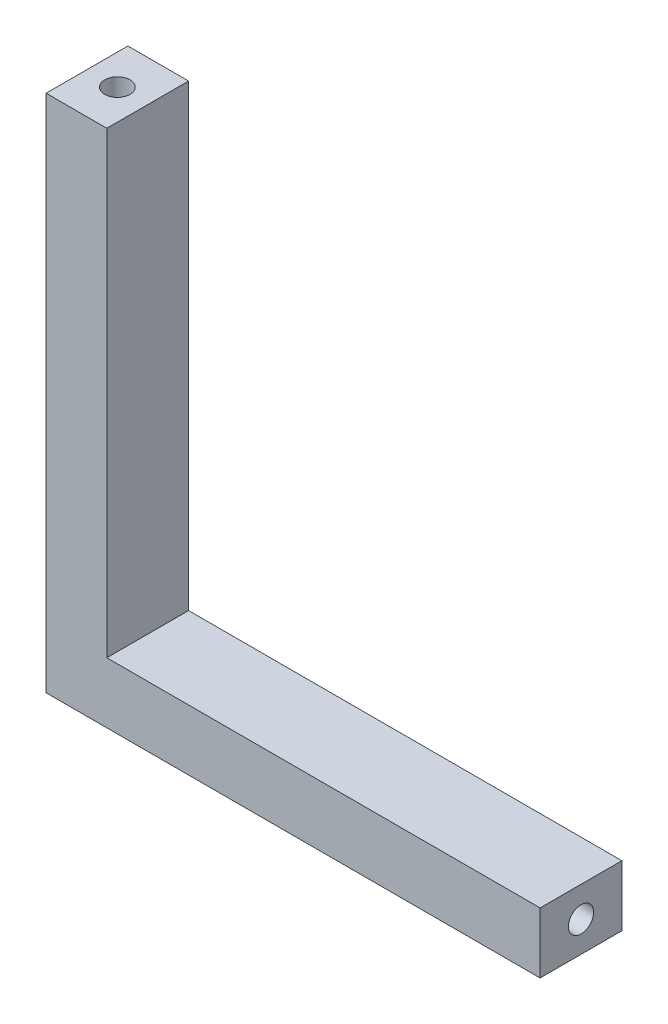
ISO-10303-21;
HEADER;
FILE_DESCRIPTION(('STEP AP214'),'2;1');
FILE_NAME('part.step','',(''),(''),'','','');
FILE_SCHEMA(('AUTOMOTIVE_DESIGN { 1 0 10303 214 1 1 1 1 }'));
ENDSEC;
DATA;
#1=APPLICATION_CONTEXT('core data for automotive mechanical design processes');
#2=APPLICATION_PROTOCOL_DEFINITION('international standard','automotive_design',2000,#1);
#3=PRODUCT_CONTEXT('',#1,'mechanical');
#4=PRODUCT('Part','Part','',(#3));
#5=PRODUCT_RELATED_PRODUCT_CATEGORY('part','',(#4));
#6=PRODUCT_DEFINITION_FORMATION('','',#4);
#7=PRODUCT_DEFINITION_CONTEXT('part definition',#1,'design');
#8=PRODUCT_DEFINITION('design','',#6,#7);
#9=PRODUCT_DEFINITION_SHAPE('','',#8);
#10=(LENGTH_UNIT() NAMED_UNIT(*) SI_UNIT(.MILLI.,.METRE.));
#11=(NAMED_UNIT(*) PLANE_ANGLE_UNIT() SI_UNIT($,.RADIAN.));
#12=(NAMED_UNIT(*) SI_UNIT($,.STERADIAN.) SOLID_ANGLE_UNIT());
#13=UNCERTAINTY_MEASURE_WITH_UNIT(LENGTH_MEASURE(1.E-05),#10,'distance_accuracy_value','');
#14=(GEOMETRIC_REPRESENTATION_CONTEXT(3) GLOBAL_UNCERTAINTY_ASSIGNED_CONTEXT((#13)) GLOBAL_UNIT_ASSIGNED_CONTEXT((#10,
#11,#12)) REPRESENTATION_CONTEXT('',''));
#15=CARTESIAN_POINT('',(0.,0.,0.));
#16=DIRECTION('',(0.,0.,1.));
#17=DIRECTION('',(1.,0.,0.));
#18=AXIS2_PLACEMENT_3D('',#15,#16,#17);
#19=CARTESIAN_POINT('',(0.,0.,0.));
#20=DIRECTION('',(0.,1.,0.));
#21=DIRECTION('',(0.,0.,1.));
#22=AXIS2_PLACEMENT_3D('',#19,#20,#21);
#23=CYLINDRICAL_SURFACE('',#22,1.5);
#24=CARTESIAN_POINT('',(0.,58.,0.));
#25=DIRECTION('',(0.,1.,0.));
#26=DIRECTION('',(0.,0.,1.));
#27=AXIS2_PLACEMENT_3D('',#24,#25,#26);
#28=CIRCLE('',#27,1.5);
#29=CARTESIAN_POINT('',(0.,58.,1.5));
#30=VERTEX_POINT('',#29);
#31=EDGE_CURVE('E90',#30,#30,#28,.F.);
#32=ORIENTED_EDGE('',*,*,#31,.F.);
#33=EDGE_LOOP('',(#32));
#34=FACE_BOUND('',#33,.T.);
#35=CARTESIAN_POINT('',(0.,0.,0.));
#36=DIRECTION('',(-0.707106781186547,0.707106781186547,0.));
#37=DIRECTION('',(0.707106781186547,0.707106781186547,0.));
#38=AXIS2_PLACEMENT_3D('',#35,#36,#37);
#39=ELLIPSE('',#38,2.12132034355964,1.5);
#40=CARTESIAN_POINT('',(1.5,1.5,0.));
#41=VERTEX_POINT('',#40);
#42=EDGE_CURVE('E19',#41,#41,#39,.F.);
#43=ORIENTED_EDGE('',*,*,#42,.T.);
#44=EDGE_LOOP('',(#43));
#45=FACE_BOUND('',#44,.T.);
#46=ADVANCED_FACE('F16',(#34,#45),#23,.F.);
#47=CARTESIAN_POINT('',(-12.0801490057035,-3.6,4.85));
#48=DIRECTION('',(0.,0.,1.));
#49=DIRECTION('',(0.,-1.,0.));
#50=AXIS2_PLACEMENT_3D('',#47,#48,#49);
#51=PLANE('',#50);
#52=DIRECTION('',(1.,0.,0.));
#53=VECTOR('',#52,1.);
#54=CARTESIAN_POINT('',(-12.0801490057035,-3.6,4.85));
#55=LINE('',#54,#53);
#56=CARTESIAN_POINT('',(55.,-3.6,4.85));
#57=VERTEX_POINT('',#56);
#58=CARTESIAN_POINT('',(-3.6,-3.6,4.85));
#59=VERTEX_POINT('',#58);
#60=EDGE_CURVE('E72',#57,#59,#55,.F.);
#61=ORIENTED_EDGE('',*,*,#60,.F.);
#62=DIRECTION('',(0.,1.,0.));
#63=VECTOR('',#62,1.);
#64=CARTESIAN_POINT('',(55.,3.6,4.85));
#65=LINE('',#64,#63);
#66=CARTESIAN_POINT('',(55.,3.6,4.85));
#67=VERTEX_POINT('',#66);
#68=EDGE_CURVE('E99',#57,#67,#65,.T.);
#69=ORIENTED_EDGE('',*,*,#68,.T.);
#70=DIRECTION('',(-1.,0.,0.));
#71=VECTOR('',#70,1.);
#72=CARTESIAN_POINT('',(-12.0801490057035,3.6,4.85));
#73=LINE('',#72,#71);
#74=CARTESIAN_POINT('',(3.6,3.6,4.85));
#75=VERTEX_POINT('',#74);
#76=EDGE_CURVE('E109',#75,#67,#73,.F.);
#77=ORIENTED_EDGE('',*,*,#76,.F.);
#78=DIRECTION('',(0.,1.,0.));
#79=VECTOR('',#78,1.);
#80=CARTESIAN_POINT('',(3.6,3.6,4.85));
#81=LINE('',#80,#79);
#82=CARTESIAN_POINT('',(3.6,58.,4.84999999999999));
#83=VERTEX_POINT('',#82);
#84=EDGE_CURVE('E116',#75,#83,#81,.T.);
#85=ORIENTED_EDGE('',*,*,#84,.T.);
#86=DIRECTION('',(1.,0.,0.));
#87=VECTOR('',#86,1.);
#88=CARTESIAN_POINT('',(0.,58.,4.85));
#89=LINE('',#88,#87);
#90=CARTESIAN_POINT('',(-3.6,58.,4.85));
#91=VERTEX_POINT('',#90);
#92=EDGE_CURVE('E66',#91,#83,#89,.T.);
#93=ORIENTED_EDGE('',*,*,#92,.F.);
#94=DIRECTION('',(0.,1.,0.));
#95=VECTOR('',#94,1.);
#96=CARTESIAN_POINT('',(-3.6,-3.6,4.85));
#97=LINE('',#96,#95);
#98=EDGE_CURVE('E68',#91,#59,#97,.F.);
#99=ORIENTED_EDGE('',*,*,#98,.T.);
#100=EDGE_LOOP('',(#61,#69,#77,#85,#93,#99));
#101=FACE_BOUND('',#100,.T.);
#102=ADVANCED_FACE('F70',(#101),#51,.T.);
#103=CARTESIAN_POINT('',(-12.0801490057035,0.,0.));
#104=DIRECTION('',(1.,0.,0.));
#105=DIRECTION('',(0.,1.,0.));
#106=AXIS2_PLACEMENT_3D('',#103,#104,#105);
#107=CYLINDRICAL_SURFACE('',#106,1.5);
#108=ORIENTED_EDGE('',*,*,#42,.F.);
#109=EDGE_LOOP('',(#108));
#110=FACE_BOUND('',#109,.T.);
#111=CARTESIAN_POINT('',(55.,0.,0.));
#112=DIRECTION('',(1.,0.,0.));
#113=DIRECTION('',(0.,1.,0.));
#114=AXIS2_PLACEMENT_3D('',#111,#112,#113);
#115=CIRCLE('',#114,1.5);
#116=CARTESIAN_POINT('',(55.,1.5,0.));
#117=VERTEX_POINT('',#116);
#118=EDGE_CURVE('E96',#117,#117,#115,.T.);
#119=ORIENTED_EDGE('',*,*,#118,.T.);
#120=EDGE_LOOP('',(#119));
#121=FACE_BOUND('',#120,.T.);
#122=ADVANCED_FACE('F196',(#110,#121),#107,.F.);
#123=CARTESIAN_POINT('',(-12.0801490057035,-3.6,4.85));
#124=DIRECTION('',(0.,-1.,0.));
#125=DIRECTION('',(1.,0.,0.));
#126=AXIS2_PLACEMENT_3D('',#123,#124,#125);
#127=PLANE('',#126);
#128=DIRECTION('',(1.,0.,0.));
#129=VECTOR('',#128,1.);
#130=CARTESIAN_POINT('',(-12.0801490057035,-3.6,-4.85));
#131=LINE('',#130,#129);
#132=CARTESIAN_POINT('',(55.,-3.6,-4.85));
#133=VERTEX_POINT('',#132);
#134=CARTESIAN_POINT('',(-3.6,-3.6,-4.85));
#135=VERTEX_POINT('',#134);
#136=EDGE_CURVE('E98',#133,#135,#131,.F.);
#137=ORIENTED_EDGE('',*,*,#136,.F.);
#138=DIRECTION('',(0.,0.,1.));
#139=VECTOR('',#138,1.);
#140=CARTESIAN_POINT('',(55.,-3.6,4.85));
#141=LINE('',#140,#139);
#142=EDGE_CURVE('E83',#133,#57,#141,.T.);
#143=ORIENTED_EDGE('',*,*,#142,.T.);
#144=ORIENTED_EDGE('',*,*,#60,.T.);
#145=DIRECTION('',(0.,0.,-1.));
#146=VECTOR('',#145,1.);
#147=CARTESIAN_POINT('',(-3.6,-3.6,4.85));
#148=LINE('',#147,#146);
#149=EDGE_CURVE('E77',#59,#135,#148,.T.);
#150=ORIENTED_EDGE('',*,*,#149,.T.);
#151=EDGE_LOOP('',(#137,#143,#144,#150));
#152=FACE_BOUND('',#151,.T.);
#153=ADVANCED_FACE('F80',(#152),#127,.T.);
#154=CARTESIAN_POINT('',(-3.6,-3.6,4.85));
#155=DIRECTION('',(1.,0.,0.));
#156=DIRECTION('',(0.,0.,-1.));
#157=AXIS2_PLACEMENT_3D('',#154,#155,#156);
#158=PLANE('',#157);
#159=DIRECTION('',(0.,1.,0.));
#160=VECTOR('',#159,1.);
#161=CARTESIAN_POINT('',(-3.6,-3.6,-4.85));
#162=LINE('',#161,#160);
#163=CARTESIAN_POINT('',(-3.6,58.,-4.85));
#164=VERTEX_POINT('',#163);
#165=EDGE_CURVE('E88',#135,#164,#162,.T.);
#166=ORIENTED_EDGE('',*,*,#165,.F.);
#167=ORIENTED_EDGE('',*,*,#149,.F.);
#168=ORIENTED_EDGE('',*,*,#98,.F.);
#169=DIRECTION('',(0.,0.,1.));
#170=VECTOR('',#169,1.);
#171=CARTESIAN_POINT('',(-3.6,58.,0.));
#172=LINE('',#171,#170);
#173=EDGE_CURVE('E117',#164,#91,#172,.T.);
#174=ORIENTED_EDGE('',*,*,#173,.F.);
#175=EDGE_LOOP('',(#166,#167,#168,#174));
#176=FACE_BOUND('',#175,.T.);
#177=ADVANCED_FACE('F86',(#176),#158,.F.);
#178=CARTESIAN_POINT('',(0.,58.,0.));
#179=DIRECTION('',(0.,1.,0.));
#180=DIRECTION('',(0.,0.,1.));
#181=AXIS2_PLACEMENT_3D('',#178,#179,#180);
#182=PLANE('',#181);
#183=DIRECTION('',(1.,0.,0.));
#184=VECTOR('',#183,1.);
#185=CARTESIAN_POINT('',(-12.0801490057035,58.,-4.84999999999999));
#186=LINE('',#185,#184);
#187=CARTESIAN_POINT('',(3.6,58.,-4.85));
#188=VERTEX_POINT('',#187);
#189=EDGE_CURVE('E131',#164,#188,#186,.T.);
#190=ORIENTED_EDGE('',*,*,#189,.F.);
#191=ORIENTED_EDGE('',*,*,#173,.T.);
#192=ORIENTED_EDGE('',*,*,#92,.T.);
#193=DIRECTION('',(0.,0.,1.));
#194=VECTOR('',#193,1.);
#195=CARTESIAN_POINT('',(3.6,58.,4.85));
#196=LINE('',#195,#194);
#197=EDGE_CURVE('E114',#83,#188,#196,.F.);
#198=ORIENTED_EDGE('',*,*,#197,.T.);
#199=EDGE_LOOP('',(#190,#191,#192,#198));
#200=FACE_BOUND('',#199,.T.);
#201=ORIENTED_EDGE('',*,*,#31,.T.);
#202=EDGE_LOOP('',(#201));
#203=FACE_BOUND('',#202,.T.);
#204=ADVANCED_FACE('F121',(#200,#203),#182,.T.);
#205=CARTESIAN_POINT('',(3.6,3.6,4.85));
#206=DIRECTION('',(-1.,0.,0.));
#207=DIRECTION('',(0.,0.,1.));
#208=AXIS2_PLACEMENT_3D('',#205,#206,#207);
#209=PLANE('',#208);
#210=ORIENTED_EDGE('',*,*,#84,.F.);
#211=DIRECTION('',(0.,0.,1.));
#212=VECTOR('',#211,1.);
#213=CARTESIAN_POINT('',(3.6,3.6,4.85));
#214=LINE('',#213,#212);
#215=CARTESIAN_POINT('',(3.6,3.6,-4.85));
#216=VERTEX_POINT('',#215);
#217=EDGE_CURVE('E111',#216,#75,#214,.T.);
#218=ORIENTED_EDGE('',*,*,#217,.F.);
#219=DIRECTION('',(0.,1.,0.));
#220=VECTOR('',#219,1.);
#221=CARTESIAN_POINT('',(3.6,-3.6,-4.85));
#222=LINE('',#221,#220);
#223=EDGE_CURVE('E127',#188,#216,#222,.F.);
#224=ORIENTED_EDGE('',*,*,#223,.F.);
#225=ORIENTED_EDGE('',*,*,#197,.F.);
#226=EDGE_LOOP('',(#210,#218,#224,#225));
#227=FACE_BOUND('',#226,.T.);
#228=ADVANCED_FACE('F125',(#227),#209,.F.);
#229=CARTESIAN_POINT('',(-12.0801490057035,3.6,4.85));
#230=DIRECTION('',(0.,1.,0.));
#231=DIRECTION('',(-1.,0.,0.));
#232=AXIS2_PLACEMENT_3D('',#229,#230,#231);
#233=PLANE('',#232);
#234=ORIENTED_EDGE('',*,*,#76,.T.);
#235=DIRECTION('',(0.,0.,1.));
#236=VECTOR('',#235,1.);
#237=CARTESIAN_POINT('',(55.,3.6,4.85));
#238=LINE('',#237,#236);
#239=CARTESIAN_POINT('',(55.,3.6,-4.85));
#240=VERTEX_POINT('',#239);
#241=EDGE_CURVE('E34',#67,#240,#238,.F.);
#242=ORIENTED_EDGE('',*,*,#241,.T.);
#243=DIRECTION('',(1.,0.,0.));
#244=VECTOR('',#243,1.);
#245=CARTESIAN_POINT('',(-12.0801490057035,3.6,-4.85));
#246=LINE('',#245,#244);
#247=EDGE_CURVE('E25',#216,#240,#246,.T.);
#248=ORIENTED_EDGE('',*,*,#247,.F.);
#249=ORIENTED_EDGE('',*,*,#217,.T.);
#250=EDGE_LOOP('',(#234,#242,#248,#249));
#251=FACE_BOUND('',#250,.T.);
#252=ADVANCED_FACE('F136',(#251),#233,.T.);
#253=CARTESIAN_POINT('',(55.,3.6,4.85));
#254=DIRECTION('',(-1.,0.,0.));
#255=DIRECTION('',(0.,0.,1.));
#256=AXIS2_PLACEMENT_3D('',#253,#254,#255);
#257=PLANE('',#256);
#258=ORIENTED_EDGE('',*,*,#118,.F.);
#259=EDGE_LOOP('',(#258));
#260=FACE_BOUND('',#259,.T.);
#261=ORIENTED_EDGE('',*,*,#142,.F.);
#262=DIRECTION('',(0.,1.,0.));
#263=VECTOR('',#262,1.);
#264=CARTESIAN_POINT('',(55.,-3.6,-4.85));
#265=LINE('',#264,#263);
#266=EDGE_CURVE('E11',#240,#133,#265,.F.);
#267=ORIENTED_EDGE('',*,*,#266,.F.);
#268=ORIENTED_EDGE('',*,*,#241,.F.);
#269=ORIENTED_EDGE('',*,*,#68,.F.);
#270=EDGE_LOOP('',(#261,#267,#268,#269));
#271=FACE_BOUND('',#270,.T.);
#272=ADVANCED_FACE('F138',(#260,#271),#257,.F.);
#273=CARTESIAN_POINT('',(-12.0801490057035,-3.6,-4.85));
#274=DIRECTION('',(0.,0.,-1.));
#275=DIRECTION('',(0.,1.,0.));
#276=AXIS2_PLACEMENT_3D('',#273,#274,#275);
#277=PLANE('',#276);
#278=ORIENTED_EDGE('',*,*,#247,.T.);
#279=ORIENTED_EDGE('',*,*,#266,.T.);
#280=ORIENTED_EDGE('',*,*,#136,.T.);
#281=ORIENTED_EDGE('',*,*,#165,.T.);
#282=ORIENTED_EDGE('',*,*,#189,.T.);
#283=ORIENTED_EDGE('',*,*,#223,.T.);
#284=EDGE_LOOP('',(#278,#279,#280,#281,#282,#283));
#285=FACE_BOUND('',#284,.T.);
#286=ADVANCED_FACE('F133',(#285),#277,.T.);
#287=CLOSED_SHELL('',(#46,#102,#122,#153,#177,#204,#228,#252,#272,#286));
#288=MANIFOLD_SOLID_BREP('B1',#287);
#289=ADVANCED_BREP_SHAPE_REPRESENTATION('',(#18,#288),#14);
#290=SHAPE_DEFINITION_REPRESENTATION(#9,#289);
ENDSEC;
END-ISO-10303-21;
